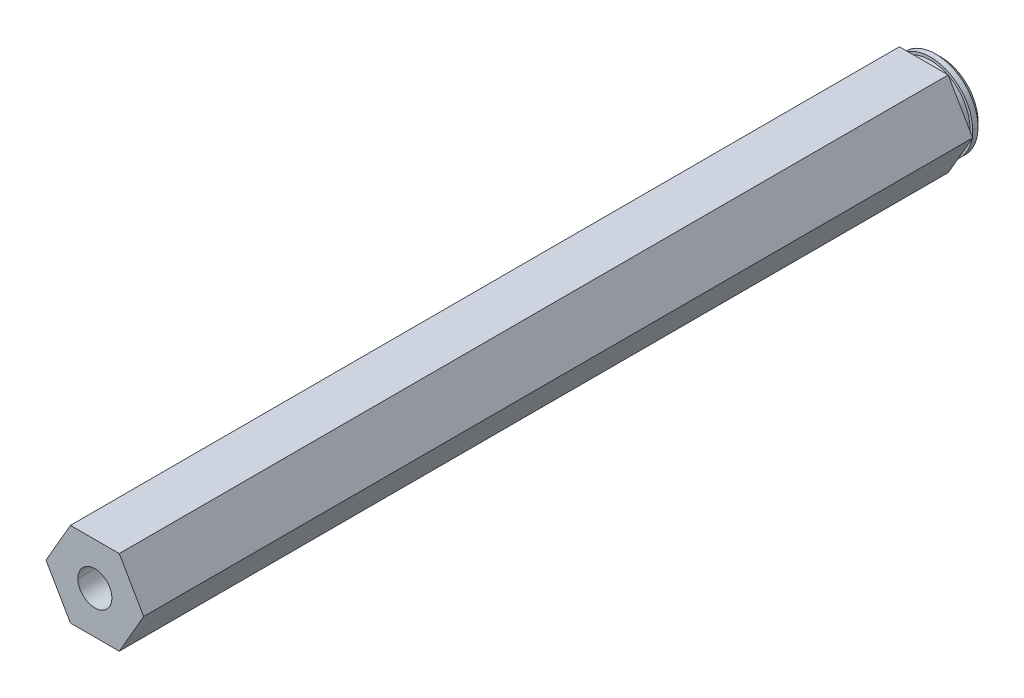
ISO-10303-21;
HEADER;
FILE_DESCRIPTION(('STEP AP214'),'2;1');
FILE_NAME('part.step','',(''),(''),'','','');
FILE_SCHEMA(('AUTOMOTIVE_DESIGN { 1 0 10303 214 1 1 1 1 }'));
ENDSEC;
DATA;
#1=APPLICATION_CONTEXT('core data for automotive mechanical design processes');
#2=APPLICATION_PROTOCOL_DEFINITION('international standard','automotive_design',2000,#1);
#3=PRODUCT_CONTEXT('',#1,'mechanical');
#4=PRODUCT('Part','Part','',(#3));
#5=PRODUCT_RELATED_PRODUCT_CATEGORY('part','',(#4));
#6=PRODUCT_DEFINITION_FORMATION('','',#4);
#7=PRODUCT_DEFINITION_CONTEXT('part definition',#1,'design');
#8=PRODUCT_DEFINITION('design','',#6,#7);
#9=PRODUCT_DEFINITION_SHAPE('','',#8);
#10=(LENGTH_UNIT() NAMED_UNIT(*) SI_UNIT(.MILLI.,.METRE.));
#11=(NAMED_UNIT(*) PLANE_ANGLE_UNIT() SI_UNIT($,.RADIAN.));
#12=(NAMED_UNIT(*) SI_UNIT($,.STERADIAN.) SOLID_ANGLE_UNIT());
#13=UNCERTAINTY_MEASURE_WITH_UNIT(LENGTH_MEASURE(1.E-05),#10,'distance_accuracy_value','');
#14=(GEOMETRIC_REPRESENTATION_CONTEXT(3) GLOBAL_UNCERTAINTY_ASSIGNED_CONTEXT((#13)) GLOBAL_UNIT_ASSIGNED_CONTEXT((#10,
#11,#12)) REPRESENTATION_CONTEXT('',''));
#15=CARTESIAN_POINT('',(0.,0.,0.));
#16=DIRECTION('',(0.,0.,1.));
#17=DIRECTION('',(1.,0.,0.));
#18=AXIS2_PLACEMENT_3D('',#15,#16,#17);
#19=CARTESIAN_POINT('',(0.,0.,-62.70625));
#20=DIRECTION('',(0.,0.,1.));
#21=DIRECTION('',(1.,0.,0.));
#22=AXIS2_PLACEMENT_3D('',#19,#20,#21);
#23=CONICAL_SURFACE('',#22,6.35,0.785398163397452);
#24=CARTESIAN_POINT('',(0.,0.,-63.5));
#25=DIRECTION('',(0.,0.,-1.));
#26=DIRECTION('',(1.,0.,0.));
#27=AXIS2_PLACEMENT_3D('',#24,#25,#26);
#28=CIRCLE('',#27,5.55625);
#29=CARTESIAN_POINT('',(-5.55625,0.,-63.5));
#30=VERTEX_POINT('',#29);
#31=CARTESIAN_POINT('',(5.55625,0.,-63.5));
#32=VERTEX_POINT('',#31);
#33=EDGE_CURVE('E41',#30,#32,#28,.T.);
#34=ORIENTED_EDGE('',*,*,#33,.F.);
#35=DIRECTION('',(-0.70710678118655,0.,0.707106781186545));
#36=VECTOR('',#35,1.);
#37=CARTESIAN_POINT('',(-6.35,0.,-62.70625));
#38=LINE('',#37,#36);
#39=CARTESIAN_POINT('',(-6.35,0.,-62.70625));
#40=VERTEX_POINT('',#39);
#41=EDGE_CURVE('E11',#30,#40,#38,.T.);
#42=ORIENTED_EDGE('',*,*,#41,.T.);
#43=CARTESIAN_POINT('',(0.,0.,-62.70625));
#44=DIRECTION('',(0.,0.,1.));
#45=DIRECTION('',(1.,0.,0.));
#46=AXIS2_PLACEMENT_3D('',#43,#44,#45);
#47=CIRCLE('',#46,6.35);
#48=CARTESIAN_POINT('',(6.35,0.,-62.70625));
#49=VERTEX_POINT('',#48);
#50=EDGE_CURVE('E240',#49,#40,#47,.T.);
#51=ORIENTED_EDGE('',*,*,#50,.F.);
#52=DIRECTION('',(0.70710678118655,0.,0.707106781186545));
#53=VECTOR('',#52,1.);
#54=CARTESIAN_POINT('',(6.35,0.,-62.70625));
#55=LINE('',#54,#53);
#56=EDGE_CURVE('E214',#32,#49,#55,.T.);
#57=ORIENTED_EDGE('',*,*,#56,.F.);
#58=EDGE_LOOP('',(#34,#42,#51,#57));
#59=FACE_BOUND('',#58,.T.);
#60=ADVANCED_FACE('F16',(#59),#23,.T.);
#61=CARTESIAN_POINT('',(0.,0.,-60.9219));
#62=DIRECTION('',(0.,0.,-1.));
#63=DIRECTION('',(-1.,0.,0.));
#64=AXIS2_PLACEMENT_3D('',#61,#62,#63);
#65=CYLINDRICAL_SURFACE('',#64,6.35);
#66=CARTESIAN_POINT('',(0.,0.,-61.9125));
#67=DIRECTION('',(0.,0.,1.));
#68=DIRECTION('',(1.,0.,0.));
#69=AXIS2_PLACEMENT_3D('',#66,#67,#68);
#70=CIRCLE('',#69,6.35);
#71=CARTESIAN_POINT('',(6.35,0.,-61.9125));
#72=VERTEX_POINT('',#71);
#73=CARTESIAN_POINT('',(-6.35,0.,-61.9125));
#74=VERTEX_POINT('',#73);
#75=EDGE_CURVE('E218',#72,#74,#70,.T.);
#76=ORIENTED_EDGE('',*,*,#75,.F.);
#77=DIRECTION('',(0.,0.,-1.));
#78=VECTOR('',#77,1.);
#79=CARTESIAN_POINT('',(6.35,0.,-60.9219));
#80=LINE('',#79,#78);
#81=EDGE_CURVE('E27',#72,#49,#80,.T.);
#82=ORIENTED_EDGE('',*,*,#81,.T.);
#83=ORIENTED_EDGE('',*,*,#50,.T.);
#84=DIRECTION('',(0.,0.,-1.));
#85=VECTOR('',#84,1.);
#86=CARTESIAN_POINT('',(-6.35,0.,-60.9219));
#87=LINE('',#86,#85);
#88=EDGE_CURVE('E213',#74,#40,#87,.T.);
#89=ORIENTED_EDGE('',*,*,#88,.F.);
#90=EDGE_LOOP('',(#76,#82,#83,#89));
#91=FACE_BOUND('',#90,.T.);
#92=ADVANCED_FACE('F431',(#91),#65,.T.);
#93=CARTESIAN_POINT('',(0.,0.,-63.5));
#94=DIRECTION('',(0.,0.,-1.));
#95=DIRECTION('',(-1.,0.,0.));
#96=AXIS2_PLACEMENT_3D('',#93,#94,#95);
#97=CYLINDRICAL_SURFACE('',#96,3.1877);
#98=CARTESIAN_POINT('',(0.,0.,-38.1));
#99=DIRECTION('',(0.,0.,-1.));
#100=DIRECTION('',(-1.,0.,0.));
#101=AXIS2_PLACEMENT_3D('',#98,#99,#100);
#102=CIRCLE('',#101,3.1877);
#103=CARTESIAN_POINT('',(3.1877,0.,-38.1));
#104=VERTEX_POINT('',#103);
#105=CARTESIAN_POINT('',(-3.1877,0.,-38.1));
#106=VERTEX_POINT('',#105);
#107=EDGE_CURVE('E247',#104,#106,#102,.T.);
#108=ORIENTED_EDGE('',*,*,#107,.F.);
#109=DIRECTION('',(0.,0.,-1.));
#110=VECTOR('',#109,1.);
#111=CARTESIAN_POINT('',(3.1877,0.,-63.5));
#112=LINE('',#111,#110);
#113=CARTESIAN_POINT('',(3.1877,0.,-63.5));
#114=VERTEX_POINT('',#113);
#115=EDGE_CURVE('E231',#104,#114,#112,.T.);
#116=ORIENTED_EDGE('',*,*,#115,.T.);
#117=CARTESIAN_POINT('',(0.,0.,-63.5));
#118=DIRECTION('',(0.,0.,-1.));
#119=DIRECTION('',(-1.,0.,0.));
#120=AXIS2_PLACEMENT_3D('',#117,#118,#119);
#121=CIRCLE('',#120,3.1877);
#122=CARTESIAN_POINT('',(-3.1877,0.,-63.5));
#123=VERTEX_POINT('',#122);
#124=EDGE_CURVE('E227',#114,#123,#121,.T.);
#125=ORIENTED_EDGE('',*,*,#124,.T.);
#126=DIRECTION('',(0.,0.,-1.));
#127=VECTOR('',#126,1.);
#128=CARTESIAN_POINT('',(-3.1877,0.,-63.5));
#129=LINE('',#128,#127);
#130=EDGE_CURVE('E182',#106,#123,#129,.T.);
#131=ORIENTED_EDGE('',*,*,#130,.F.);
#132=EDGE_LOOP('',(#108,#116,#125,#131));
#133=FACE_BOUND('',#132,.T.);
#134=ADVANCED_FACE('F346',(#133),#97,.F.);
#135=CARTESIAN_POINT('',(0.,0.,-38.1));
#136=DIRECTION('',(0.,0.,-1.));
#137=DIRECTION('',(-1.,0.,0.));
#138=AXIS2_PLACEMENT_3D('',#135,#136,#137);
#139=CONICAL_SURFACE('',#138,3.1877,1.02974425867665);
#140=DIRECTION('',(-0.857167300702111,0.,-0.515038074910056));
#141=VECTOR('',#140,1.);
#142=CARTESIAN_POINT('',(-3.1877,0.,-38.1));
#143=LINE('',#142,#141);
#144=CARTESIAN_POINT('',(0.,0.,-36.1846366047259));
#145=VERTEX_POINT('',#144);
#146=EDGE_CURVE('E181',#145,#106,#143,.T.);
#147=ORIENTED_EDGE('',*,*,#146,.F.);
#148=DIRECTION('',(0.857167300702111,0.,-0.515038074910056));
#149=VECTOR('',#148,1.);
#150=CARTESIAN_POINT('',(3.1877,0.,-38.1));
#151=LINE('',#150,#149);
#152=EDGE_CURVE('E232',#145,#104,#151,.T.);
#153=ORIENTED_EDGE('',*,*,#152,.T.);
#154=ORIENTED_EDGE('',*,*,#107,.T.);
#155=EDGE_LOOP('',(#147,#153,#154));
#156=FACE_BOUND('',#155,.T.);
#157=ADVANCED_FACE('F353',(#156),#139,.F.);
#158=CARTESIAN_POINT('',(0.,0.,0.));
#159=DIRECTION('',(0.,0.,1.));
#160=DIRECTION('',(1.,0.,0.));
#161=AXIS2_PLACEMENT_3D('',#158,#159,#160);
#162=CYLINDRICAL_SURFACE('',#161,5.9436);
#163=CARTESIAN_POINT('',(0.,0.,-61.9125));
#164=DIRECTION('',(0.,0.,1.));
#165=DIRECTION('',(1.,0.,0.));
#166=AXIS2_PLACEMENT_3D('',#163,#164,#165);
#167=CIRCLE('',#166,5.9436);
#168=CARTESIAN_POINT('',(5.9436,0.,-61.9125));
#169=VERTEX_POINT('',#168);
#170=CARTESIAN_POINT('',(-5.9436,0.,-61.9125));
#171=VERTEX_POINT('',#170);
#172=EDGE_CURVE('E223',#169,#171,#167,.T.);
#173=ORIENTED_EDGE('',*,*,#172,.T.);
#174=DIRECTION('',(0.,0.,1.));
#175=VECTOR('',#174,1.);
#176=CARTESIAN_POINT('',(-5.9436,0.,0.));
#177=LINE('',#176,#175);
#178=CARTESIAN_POINT('',(-5.9436,0.,-60.9219));
#179=VERTEX_POINT('',#178);
#180=EDGE_CURVE('E219',#171,#179,#177,.T.);
#181=ORIENTED_EDGE('',*,*,#180,.T.);
#182=CARTESIAN_POINT('',(0.,0.,-60.9219));
#183=DIRECTION('',(0.,0.,1.));
#184=DIRECTION('',(1.,0.,0.));
#185=AXIS2_PLACEMENT_3D('',#182,#183,#184);
#186=CIRCLE('',#185,5.9436);
#187=CARTESIAN_POINT('',(5.9436,0.,-60.9219));
#188=VERTEX_POINT('',#187);
#189=EDGE_CURVE('E263',#188,#179,#186,.T.);
#190=ORIENTED_EDGE('',*,*,#189,.F.);
#191=DIRECTION('',(0.,0.,1.));
#192=VECTOR('',#191,1.);
#193=CARTESIAN_POINT('',(5.9436,0.,0.));
#194=LINE('',#193,#192);
#195=EDGE_CURVE('E203',#169,#188,#194,.T.);
#196=ORIENTED_EDGE('',*,*,#195,.F.);
#197=EDGE_LOOP('',(#173,#181,#190,#196));
#198=FACE_BOUND('',#197,.T.);
#199=ADVANCED_FACE('F444',(#198),#162,.T.);
#200=CARTESIAN_POINT('',(0.,0.,63.5));
#201=DIRECTION('',(0.,0.,1.));
#202=DIRECTION('',(1.,0.,0.));
#203=AXIS2_PLACEMENT_3D('',#200,#201,#202);
#204=CYLINDRICAL_SURFACE('',#203,2.5527);
#205=CARTESIAN_POINT('',(0.,0.,0.));
#206=DIRECTION('',(0.,0.,1.));
#207=DIRECTION('',(1.,0.,0.));
#208=AXIS2_PLACEMENT_3D('',#205,#206,#207);
#209=CIRCLE('',#208,2.5527);
#210=CARTESIAN_POINT('',(-2.5527,0.,0.));
#211=VERTEX_POINT('',#210);
#212=CARTESIAN_POINT('',(2.5527,0.,0.));
#213=VERTEX_POINT('',#212);
#214=EDGE_CURVE('E250',#211,#213,#209,.T.);
#215=ORIENTED_EDGE('',*,*,#214,.F.);
#216=DIRECTION('',(0.,0.,1.));
#217=VECTOR('',#216,1.);
#218=CARTESIAN_POINT('',(-2.5527,0.,63.5));
#219=LINE('',#218,#217);
#220=CARTESIAN_POINT('',(-2.5527,0.,63.5));
#221=VERTEX_POINT('',#220);
#222=EDGE_CURVE('E20',#211,#221,#219,.T.);
#223=ORIENTED_EDGE('',*,*,#222,.T.);
#224=CARTESIAN_POINT('',(0.,0.,63.5));
#225=DIRECTION('',(0.,0.,1.));
#226=DIRECTION('',(1.,0.,0.));
#227=AXIS2_PLACEMENT_3D('',#224,#225,#226);
#228=CIRCLE('',#227,2.5527);
#229=CARTESIAN_POINT('',(2.5527,0.,63.5));
#230=VERTEX_POINT('',#229);
#231=EDGE_CURVE('E235',#221,#230,#228,.T.);
#232=ORIENTED_EDGE('',*,*,#231,.T.);
#233=DIRECTION('',(0.,0.,1.));
#234=VECTOR('',#233,1.);
#235=CARTESIAN_POINT('',(2.5527,0.,63.5));
#236=LINE('',#235,#234);
#237=EDGE_CURVE('E297',#213,#230,#236,.T.);
#238=ORIENTED_EDGE('',*,*,#237,.F.);
#239=EDGE_LOOP('',(#215,#223,#232,#238));
#240=FACE_BOUND('',#239,.T.);
#241=ADVANCED_FACE('F380',(#240),#204,.F.);
#242=CARTESIAN_POINT('',(0.,0.,0.));
#243=DIRECTION('',(0.,0.,1.));
#244=DIRECTION('',(1.,0.,0.));
#245=AXIS2_PLACEMENT_3D('',#242,#243,#244);
#246=CONICAL_SURFACE('',#245,2.5527,1.02974425867665);
#247=DIRECTION('',(0.857167300702108,0.,0.515038074910061));
#248=VECTOR('',#247,1.);
#249=CARTESIAN_POINT('',(2.5527,0.,0.));
#250=LINE('',#249,#248);
#251=CARTESIAN_POINT('',(0.,0.,-1.53381690219166));
#252=VERTEX_POINT('',#251);
#253=EDGE_CURVE('E197',#252,#213,#250,.T.);
#254=ORIENTED_EDGE('',*,*,#253,.F.);
#255=DIRECTION('',(-0.857167300702108,0.,0.515038074910061));
#256=VECTOR('',#255,1.);
#257=CARTESIAN_POINT('',(-2.5527,0.,0.));
#258=LINE('',#257,#256);
#259=EDGE_CURVE('E239',#252,#211,#258,.T.);
#260=ORIENTED_EDGE('',*,*,#259,.T.);
#261=ORIENTED_EDGE('',*,*,#214,.T.);
#262=EDGE_LOOP('',(#254,#260,#261));
#263=FACE_BOUND('',#262,.T.);
#264=ADVANCED_FACE('F388',(#263),#246,.F.);
#265=CARTESIAN_POINT('',(3.66617420935412,-6.35,63.5));
#266=DIRECTION('',(-0.866025403784439,0.5,0.));
#267=DIRECTION('',(0.,0.,1.));
#268=AXIS2_PLACEMENT_3D('',#265,#266,#267);
#269=PLANE('',#268);
#270=DIRECTION('',(-0.5,-0.866025403784439,0.));
#271=VECTOR('',#270,1.);
#272=CARTESIAN_POINT('',(3.66617420935412,-6.35,-60.9219));
#273=LINE('',#272,#271);
#274=CARTESIAN_POINT('',(7.33234841870825,0.,-60.9219));
#275=VERTEX_POINT('',#274);
#276=CARTESIAN_POINT('',(3.66617420935412,-6.35,-60.9219));
#277=VERTEX_POINT('',#276);
#278=EDGE_CURVE('E158',#275,#277,#273,.T.);
#279=ORIENTED_EDGE('',*,*,#278,.F.);
#280=DIRECTION('',(0.,0.,-1.));
#281=VECTOR('',#280,1.);
#282=CARTESIAN_POINT('',(7.33234841870825,0.,63.5));
#283=LINE('',#282,#281);
#284=CARTESIAN_POINT('',(7.33234841870825,0.,63.5));
#285=VERTEX_POINT('',#284);
#286=EDGE_CURVE('E155',#285,#275,#283,.T.);
#287=ORIENTED_EDGE('',*,*,#286,.F.);
#288=DIRECTION('',(0.5,0.866025403784439,0.));
#289=VECTOR('',#288,1.);
#290=CARTESIAN_POINT('',(3.66617420935412,-6.35,63.5));
#291=LINE('',#290,#289);
#292=CARTESIAN_POINT('',(3.66617420935412,-6.35,63.5));
#293=VERTEX_POINT('',#292);
#294=EDGE_CURVE('E138',#293,#285,#291,.T.);
#295=ORIENTED_EDGE('',*,*,#294,.F.);
#296=DIRECTION('',(0.,0.,-1.));
#297=VECTOR('',#296,1.);
#298=CARTESIAN_POINT('',(3.66617420935412,-6.35,63.5));
#299=LINE('',#298,#297);
#300=EDGE_CURVE('E162',#293,#277,#299,.T.);
#301=ORIENTED_EDGE('',*,*,#300,.T.);
#302=EDGE_LOOP('',(#279,#287,#295,#301));
#303=FACE_BOUND('',#302,.T.);
#304=ADVANCED_FACE('F156',(#303),#269,.F.);
#305=CARTESIAN_POINT('',(7.33234841870825,0.,63.5));
#306=DIRECTION('',(-0.866025403784439,-0.5,0.));
#307=DIRECTION('',(-0.5,0.866025403784439,0.));
#308=AXIS2_PLACEMENT_3D('',#305,#306,#307);
#309=PLANE('',#308);
#310=DIRECTION('',(0.5,-0.866025403784439,0.));
#311=VECTOR('',#310,1.);
#312=CARTESIAN_POINT('',(7.33234841870825,0.,-60.9219));
#313=LINE('',#312,#311);
#314=CARTESIAN_POINT('',(3.6661742093541,6.35,-60.9219));
#315=VERTEX_POINT('',#314);
#316=EDGE_CURVE('E188',#315,#275,#313,.T.);
#317=ORIENTED_EDGE('',*,*,#316,.F.);
#318=DIRECTION('',(0.,0.,-1.));
#319=VECTOR('',#318,1.);
#320=CARTESIAN_POINT('',(3.6661742093541,6.35,63.5));
#321=LINE('',#320,#319);
#322=CARTESIAN_POINT('',(3.6661742093541,6.35,63.5));
#323=VERTEX_POINT('',#322);
#324=EDGE_CURVE('E163',#323,#315,#321,.T.);
#325=ORIENTED_EDGE('',*,*,#324,.F.);
#326=DIRECTION('',(-0.5,0.866025403784439,0.));
#327=VECTOR('',#326,1.);
#328=CARTESIAN_POINT('',(7.33234841870825,0.,63.5));
#329=LINE('',#328,#327);
#330=EDGE_CURVE('E143',#285,#323,#329,.T.);
#331=ORIENTED_EDGE('',*,*,#330,.F.);
#332=ORIENTED_EDGE('',*,*,#286,.T.);
#333=EDGE_LOOP('',(#317,#325,#331,#332));
#334=FACE_BOUND('',#333,.T.);
#335=ADVANCED_FACE('F18',(#334),#309,.F.);
#336=CARTESIAN_POINT('',(3.6661742093541,6.35,63.5));
#337=DIRECTION('',(0.,-1.,0.));
#338=DIRECTION('',(0.,0.,-1.));
#339=AXIS2_PLACEMENT_3D('',#336,#337,#338);
#340=PLANE('',#339);
#341=DIRECTION('',(1.,0.,0.));
#342=VECTOR('',#341,1.);
#343=CARTESIAN_POINT('',(3.6661742093541,6.35,-60.9219));
#344=LINE('',#343,#342);
#345=CARTESIAN_POINT('',(-3.66617420935414,6.35,-60.9219));
#346=VERTEX_POINT('',#345);
#347=EDGE_CURVE('E183',#346,#315,#344,.T.);
#348=ORIENTED_EDGE('',*,*,#347,.F.);
#349=DIRECTION('',(0.,0.,-1.));
#350=VECTOR('',#349,1.);
#351=CARTESIAN_POINT('',(-3.66617420935414,6.35,63.5));
#352=LINE('',#351,#350);
#353=CARTESIAN_POINT('',(-3.66617420935414,6.35,63.5));
#354=VERTEX_POINT('',#353);
#355=EDGE_CURVE('E193',#354,#346,#352,.T.);
#356=ORIENTED_EDGE('',*,*,#355,.F.);
#357=DIRECTION('',(-1.,0.,0.));
#358=VECTOR('',#357,1.);
#359=CARTESIAN_POINT('',(3.6661742093541,6.35,63.5));
#360=LINE('',#359,#358);
#361=EDGE_CURVE('E168',#323,#354,#360,.T.);
#362=ORIENTED_EDGE('',*,*,#361,.F.);
#363=ORIENTED_EDGE('',*,*,#324,.T.);
#364=EDGE_LOOP('',(#348,#356,#362,#363));
#365=FACE_BOUND('',#364,.T.);
#366=ADVANCED_FACE('F419',(#365),#340,.F.);
#367=CARTESIAN_POINT('',(-3.66617420935414,6.35,63.5));
#368=DIRECTION('',(0.866025403784439,-0.5,0.));
#369=DIRECTION('',(0.,0.,-1.));
#370=AXIS2_PLACEMENT_3D('',#367,#368,#369);
#371=PLANE('',#370);
#372=DIRECTION('',(0.5,0.866025403784439,0.));
#373=VECTOR('',#372,1.);
#374=CARTESIAN_POINT('',(-3.66617420935414,6.35,-60.9219));
#375=LINE('',#374,#373);
#376=CARTESIAN_POINT('',(-7.33234841870829,0.,-60.9219));
#377=VERTEX_POINT('',#376);
#378=EDGE_CURVE('E275',#377,#346,#375,.T.);
#379=ORIENTED_EDGE('',*,*,#378,.F.);
#380=DIRECTION('',(0.,0.,-1.));
#381=VECTOR('',#380,1.);
#382=CARTESIAN_POINT('',(-7.33234841870829,0.,63.5));
#383=LINE('',#382,#381);
#384=CARTESIAN_POINT('',(-7.33234841870829,0.,63.5));
#385=VERTEX_POINT('',#384);
#386=EDGE_CURVE('E189',#385,#377,#383,.T.);
#387=ORIENTED_EDGE('',*,*,#386,.F.);
#388=DIRECTION('',(-0.5,-0.866025403784439,0.));
#389=VECTOR('',#388,1.);
#390=CARTESIAN_POINT('',(-3.66617420935414,6.35,63.5));
#391=LINE('',#390,#389);
#392=EDGE_CURVE('E174',#354,#385,#391,.T.);
#393=ORIENTED_EDGE('',*,*,#392,.F.);
#394=ORIENTED_EDGE('',*,*,#355,.T.);
#395=EDGE_LOOP('',(#379,#387,#393,#394));
#396=FACE_BOUND('',#395,.T.);
#397=ADVANCED_FACE('F307',(#396),#371,.F.);
#398=CARTESIAN_POINT('',(-7.33234841870829,0.,63.5));
#399=DIRECTION('',(0.866025403784438,0.5,0.));
#400=DIRECTION('',(0.,0.,-1.));
#401=AXIS2_PLACEMENT_3D('',#398,#399,#400);
#402=PLANE('',#401);
#403=DIRECTION('',(-0.5,0.866025403784439,0.));
#404=VECTOR('',#403,1.);
#405=CARTESIAN_POINT('',(-7.33234841870829,0.,-60.9219));
#406=LINE('',#405,#404);
#407=CARTESIAN_POINT('',(-3.66617420935414,-6.35,-60.9219));
#408=VERTEX_POINT('',#407);
#409=EDGE_CURVE('E257',#408,#377,#406,.T.);
#410=ORIENTED_EDGE('',*,*,#409,.F.);
#411=DIRECTION('',(0.,0.,-1.));
#412=VECTOR('',#411,1.);
#413=CARTESIAN_POINT('',(-3.66617420935414,-6.35,63.5));
#414=LINE('',#413,#412);
#415=CARTESIAN_POINT('',(-3.66617420935414,-6.35,63.5));
#416=VERTEX_POINT('',#415);
#417=EDGE_CURVE('E152',#416,#408,#414,.T.);
#418=ORIENTED_EDGE('',*,*,#417,.F.);
#419=DIRECTION('',(0.5,-0.866025403784439,0.));
#420=VECTOR('',#419,1.);
#421=CARTESIAN_POINT('',(-7.33234841870829,0.,63.5));
#422=LINE('',#421,#420);
#423=EDGE_CURVE('E196',#385,#416,#422,.T.);
#424=ORIENTED_EDGE('',*,*,#423,.F.);
#425=ORIENTED_EDGE('',*,*,#386,.T.);
#426=EDGE_LOOP('',(#410,#418,#424,#425));
#427=FACE_BOUND('',#426,.T.);
#428=ADVANCED_FACE('F318',(#427),#402,.F.);
#429=CARTESIAN_POINT('',(-3.66617420935414,-6.35,63.5));
#430=DIRECTION('',(0.,1.,0.));
#431=DIRECTION('',(1.,0.,0.));
#432=AXIS2_PLACEMENT_3D('',#429,#430,#431);
#433=PLANE('',#432);
#434=DIRECTION('',(-1.,0.,0.));
#435=VECTOR('',#434,1.);
#436=CARTESIAN_POINT('',(-3.66617420935414,-6.35,-60.9219));
#437=LINE('',#436,#435);
#438=EDGE_CURVE('E253',#277,#408,#437,.T.);
#439=ORIENTED_EDGE('',*,*,#438,.F.);
#440=ORIENTED_EDGE('',*,*,#300,.F.);
#441=DIRECTION('',(1.,0.,0.));
#442=VECTOR('',#441,1.);
#443=CARTESIAN_POINT('',(-3.66617420935414,-6.35,63.5));
#444=LINE('',#443,#442);
#445=EDGE_CURVE('E147',#416,#293,#444,.T.);
#446=ORIENTED_EDGE('',*,*,#445,.F.);
#447=ORIENTED_EDGE('',*,*,#417,.T.);
#448=EDGE_LOOP('',(#439,#440,#446,#447));
#449=FACE_BOUND('',#448,.T.);
#450=ADVANCED_FACE('F321',(#449),#433,.F.);
#451=CARTESIAN_POINT('',(0.,0.,63.5));
#452=DIRECTION('',(0.,0.,1.));
#453=DIRECTION('',(1.,0.,0.));
#454=AXIS2_PLACEMENT_3D('',#451,#452,#453);
#455=PLANE('',#454);
#456=ORIENTED_EDGE('',*,*,#294,.T.);
#457=ORIENTED_EDGE('',*,*,#330,.T.);
#458=ORIENTED_EDGE('',*,*,#361,.T.);
#459=ORIENTED_EDGE('',*,*,#392,.T.);
#460=ORIENTED_EDGE('',*,*,#423,.T.);
#461=ORIENTED_EDGE('',*,*,#445,.T.);
#462=EDGE_LOOP('',(#456,#457,#458,#459,#460,#461));
#463=FACE_BOUND('',#462,.T.);
#464=CARTESIAN_POINT('',(0.,0.,63.5));
#465=DIRECTION('',(0.,0.,1.));
#466=DIRECTION('',(1.,0.,0.));
#467=AXIS2_PLACEMENT_3D('',#464,#465,#466);
#468=CIRCLE('',#467,2.5527);
#469=EDGE_CURVE('E187',#230,#221,#468,.T.);
#470=ORIENTED_EDGE('',*,*,#469,.F.);
#471=ORIENTED_EDGE('',*,*,#231,.F.);
#472=EDGE_LOOP('',(#470,#471));
#473=FACE_BOUND('',#472,.T.);
#474=ADVANCED_FACE('F140',(#463,#473),#455,.T.);
#475=CARTESIAN_POINT('',(0.,0.,0.));
#476=DIRECTION('',(0.,0.,1.));
#477=DIRECTION('',(1.,0.,0.));
#478=AXIS2_PLACEMENT_3D('',#475,#476,#477);
#479=CONICAL_SURFACE('',#478,2.5527,1.02974425867665);
#480=ORIENTED_EDGE('',*,*,#259,.F.);
#481=ORIENTED_EDGE('',*,*,#253,.T.);
#482=CARTESIAN_POINT('',(0.,0.,0.));
#483=DIRECTION('',(0.,0.,1.));
#484=DIRECTION('',(1.,0.,0.));
#485=AXIS2_PLACEMENT_3D('',#482,#483,#484);
#486=CIRCLE('',#485,2.5527);
#487=EDGE_CURVE('E279',#213,#211,#486,.T.);
#488=ORIENTED_EDGE('',*,*,#487,.T.);
#489=EDGE_LOOP('',(#480,#481,#488));
#490=FACE_BOUND('',#489,.T.);
#491=ADVANCED_FACE('F394',(#490),#479,.F.);
#492=CARTESIAN_POINT('',(0.,0.,63.5));
#493=DIRECTION('',(0.,0.,1.));
#494=DIRECTION('',(1.,0.,0.));
#495=AXIS2_PLACEMENT_3D('',#492,#493,#494);
#496=CYLINDRICAL_SURFACE('',#495,2.5527);
#497=ORIENTED_EDGE('',*,*,#222,.F.);
#498=ORIENTED_EDGE('',*,*,#487,.F.);
#499=ORIENTED_EDGE('',*,*,#237,.T.);
#500=ORIENTED_EDGE('',*,*,#469,.T.);
#501=EDGE_LOOP('',(#497,#498,#499,#500));
#502=FACE_BOUND('',#501,.T.);
#503=ADVANCED_FACE('F392',(#502),#496,.F.);
#504=CARTESIAN_POINT('',(0.,0.,-60.9219));
#505=DIRECTION('',(0.,0.,-1.));
#506=DIRECTION('',(0.,-1.,0.));
#507=AXIS2_PLACEMENT_3D('',#504,#505,#506);
#508=PLANE('',#507);
#509=ORIENTED_EDGE('',*,*,#347,.T.);
#510=ORIENTED_EDGE('',*,*,#316,.T.);
#511=ORIENTED_EDGE('',*,*,#278,.T.);
#512=ORIENTED_EDGE('',*,*,#438,.T.);
#513=ORIENTED_EDGE('',*,*,#409,.T.);
#514=ORIENTED_EDGE('',*,*,#378,.T.);
#515=EDGE_LOOP('',(#509,#510,#511,#512,#513,#514));
#516=FACE_BOUND('',#515,.T.);
#517=ORIENTED_EDGE('',*,*,#189,.T.);
#518=CARTESIAN_POINT('',(0.,0.,-60.9219));
#519=DIRECTION('',(0.,0.,1.));
#520=DIRECTION('',(1.,0.,0.));
#521=AXIS2_PLACEMENT_3D('',#518,#519,#520);
#522=CIRCLE('',#521,5.9436);
#523=EDGE_CURVE('E202',#179,#188,#522,.T.);
#524=ORIENTED_EDGE('',*,*,#523,.T.);
#525=EDGE_LOOP('',(#517,#524));
#526=FACE_BOUND('',#525,.T.);
#527=ADVANCED_FACE('F311',(#516,#526),#508,.T.);
#528=CARTESIAN_POINT('',(0.,0.,0.));
#529=DIRECTION('',(0.,0.,1.));
#530=DIRECTION('',(1.,0.,0.));
#531=AXIS2_PLACEMENT_3D('',#528,#529,#530);
#532=CYLINDRICAL_SURFACE('',#531,5.9436);
#533=ORIENTED_EDGE('',*,*,#180,.F.);
#534=CARTESIAN_POINT('',(0.,0.,-61.9125));
#535=DIRECTION('',(0.,0.,1.));
#536=DIRECTION('',(1.,0.,0.));
#537=AXIS2_PLACEMENT_3D('',#534,#535,#536);
#538=CIRCLE('',#537,5.9436);
#539=EDGE_CURVE('E198',#171,#169,#538,.T.);
#540=ORIENTED_EDGE('',*,*,#539,.T.);
#541=ORIENTED_EDGE('',*,*,#195,.T.);
#542=ORIENTED_EDGE('',*,*,#523,.F.);
#543=EDGE_LOOP('',(#533,#540,#541,#542));
#544=FACE_BOUND('',#543,.T.);
#545=ADVANCED_FACE('F458',(#544),#532,.T.);
#546=CARTESIAN_POINT('',(0.,6.35,-61.9125));
#547=DIRECTION('',(0.,0.,1.));
#548=DIRECTION('',(1.,0.,0.));
#549=AXIS2_PLACEMENT_3D('',#546,#547,#548);
#550=PLANE('',#549);
#551=CARTESIAN_POINT('',(0.,0.,-61.9125));
#552=DIRECTION('',(0.,0.,1.));
#553=DIRECTION('',(1.,0.,0.));
#554=AXIS2_PLACEMENT_3D('',#551,#552,#553);
#555=CIRCLE('',#554,6.35);
#556=EDGE_CURVE('E264',#74,#72,#555,.T.);
#557=ORIENTED_EDGE('',*,*,#556,.T.);
#558=ORIENTED_EDGE('',*,*,#75,.T.);
#559=EDGE_LOOP('',(#557,#558));
#560=FACE_BOUND('',#559,.T.);
#561=ORIENTED_EDGE('',*,*,#172,.F.);
#562=ORIENTED_EDGE('',*,*,#539,.F.);
#563=EDGE_LOOP('',(#561,#562));
#564=FACE_BOUND('',#563,.T.);
#565=ADVANCED_FACE('F461',(#560,#564),#550,.T.);
#566=CARTESIAN_POINT('',(0.,0.,-38.1));
#567=DIRECTION('',(0.,0.,-1.));
#568=DIRECTION('',(-1.,0.,0.));
#569=AXIS2_PLACEMENT_3D('',#566,#567,#568);
#570=CONICAL_SURFACE('',#569,3.1877,1.02974425867665);
#571=ORIENTED_EDGE('',*,*,#152,.F.);
#572=ORIENTED_EDGE('',*,*,#146,.T.);
#573=CARTESIAN_POINT('',(0.,0.,-38.1));
#574=DIRECTION('',(0.,0.,-1.));
#575=DIRECTION('',(-1.,0.,0.));
#576=AXIS2_PLACEMENT_3D('',#573,#574,#575);
#577=CIRCLE('',#576,3.1877);
#578=EDGE_CURVE('E177',#106,#104,#577,.T.);
#579=ORIENTED_EDGE('',*,*,#578,.T.);
#580=EDGE_LOOP('',(#571,#572,#579));
#581=FACE_BOUND('',#580,.T.);
#582=ADVANCED_FACE('F362',(#581),#570,.F.);
#583=CARTESIAN_POINT('',(0.,0.,-63.5));
#584=DIRECTION('',(0.,0.,-1.));
#585=DIRECTION('',(-1.,0.,0.));
#586=AXIS2_PLACEMENT_3D('',#583,#584,#585);
#587=CYLINDRICAL_SURFACE('',#586,3.1877);
#588=ORIENTED_EDGE('',*,*,#115,.F.);
#589=ORIENTED_EDGE('',*,*,#578,.F.);
#590=ORIENTED_EDGE('',*,*,#130,.T.);
#591=CARTESIAN_POINT('',(0.,0.,-63.5));
#592=DIRECTION('',(0.,0.,-1.));
#593=DIRECTION('',(-1.,0.,0.));
#594=AXIS2_PLACEMENT_3D('',#591,#592,#593);
#595=CIRCLE('',#594,3.1877);
#596=EDGE_CURVE('E204',#123,#114,#595,.T.);
#597=ORIENTED_EDGE('',*,*,#596,.T.);
#598=EDGE_LOOP('',(#588,#589,#590,#597));
#599=FACE_BOUND('',#598,.T.);
#600=ADVANCED_FACE('F358',(#599),#587,.F.);
#601=CARTESIAN_POINT('',(0.,0.,-63.5));
#602=DIRECTION('',(0.,0.,1.));
#603=DIRECTION('',(1.,0.,0.));
#604=AXIS2_PLACEMENT_3D('',#601,#602,#603);
#605=PLANE('',#604);
#606=CARTESIAN_POINT('',(0.,0.,-63.5));
#607=DIRECTION('',(0.,0.,-1.));
#608=DIRECTION('',(1.,0.,0.));
#609=AXIS2_PLACEMENT_3D('',#606,#607,#608);
#610=CIRCLE('',#609,5.55625);
#611=EDGE_CURVE('E208',#32,#30,#610,.T.);
#612=ORIENTED_EDGE('',*,*,#611,.T.);
#613=ORIENTED_EDGE('',*,*,#33,.T.);
#614=EDGE_LOOP('',(#612,#613));
#615=FACE_BOUND('',#614,.T.);
#616=ORIENTED_EDGE('',*,*,#596,.F.);
#617=ORIENTED_EDGE('',*,*,#124,.F.);
#618=EDGE_LOOP('',(#616,#617));
#619=FACE_BOUND('',#618,.T.);
#620=ADVANCED_FACE('F472',(#615,#619),#605,.F.);
#621=CARTESIAN_POINT('',(0.,0.,-60.9219));
#622=DIRECTION('',(0.,0.,-1.));
#623=DIRECTION('',(-1.,0.,0.));
#624=AXIS2_PLACEMENT_3D('',#621,#622,#623);
#625=CYLINDRICAL_SURFACE('',#624,6.35);
#626=ORIENTED_EDGE('',*,*,#81,.F.);
#627=ORIENTED_EDGE('',*,*,#556,.F.);
#628=ORIENTED_EDGE('',*,*,#88,.T.);
#629=CARTESIAN_POINT('',(0.,0.,-62.70625));
#630=DIRECTION('',(0.,0.,1.));
#631=DIRECTION('',(1.,0.,0.));
#632=AXIS2_PLACEMENT_3D('',#629,#630,#631);
#633=CIRCLE('',#632,6.35);
#634=EDGE_CURVE('E209',#40,#49,#633,.T.);
#635=ORIENTED_EDGE('',*,*,#634,.T.);
#636=EDGE_LOOP('',(#626,#627,#628,#635));
#637=FACE_BOUND('',#636,.T.);
#638=ADVANCED_FACE('F488',(#637),#625,.T.);
#639=CARTESIAN_POINT('',(0.,0.,-62.70625));
#640=DIRECTION('',(0.,0.,1.));
#641=DIRECTION('',(1.,0.,0.));
#642=AXIS2_PLACEMENT_3D('',#639,#640,#641);
#643=CONICAL_SURFACE('',#642,6.35,0.785398163397452);
#644=ORIENTED_EDGE('',*,*,#41,.F.);
#645=ORIENTED_EDGE('',*,*,#611,.F.);
#646=ORIENTED_EDGE('',*,*,#56,.T.);
#647=ORIENTED_EDGE('',*,*,#634,.F.);
#648=EDGE_LOOP('',(#644,#645,#646,#647));
#649=FACE_BOUND('',#648,.T.);
#650=ADVANCED_FACE('F452',(#649),#643,.T.);
#651=CLOSED_SHELL('',(#60,#92,#134,#157,#199,#241,#264,#304,#335,#366,#397,#428,#450,#474,#491,
#503,#527,#545,#565,#582,#600,#620,#638,#650));
#652=MANIFOLD_SOLID_BREP('B1',#651);
#653=ADVANCED_BREP_SHAPE_REPRESENTATION('',(#18,#652),#14);
#654=SHAPE_DEFINITION_REPRESENTATION(#9,#653);
ENDSEC;
END-ISO-10303-21;
